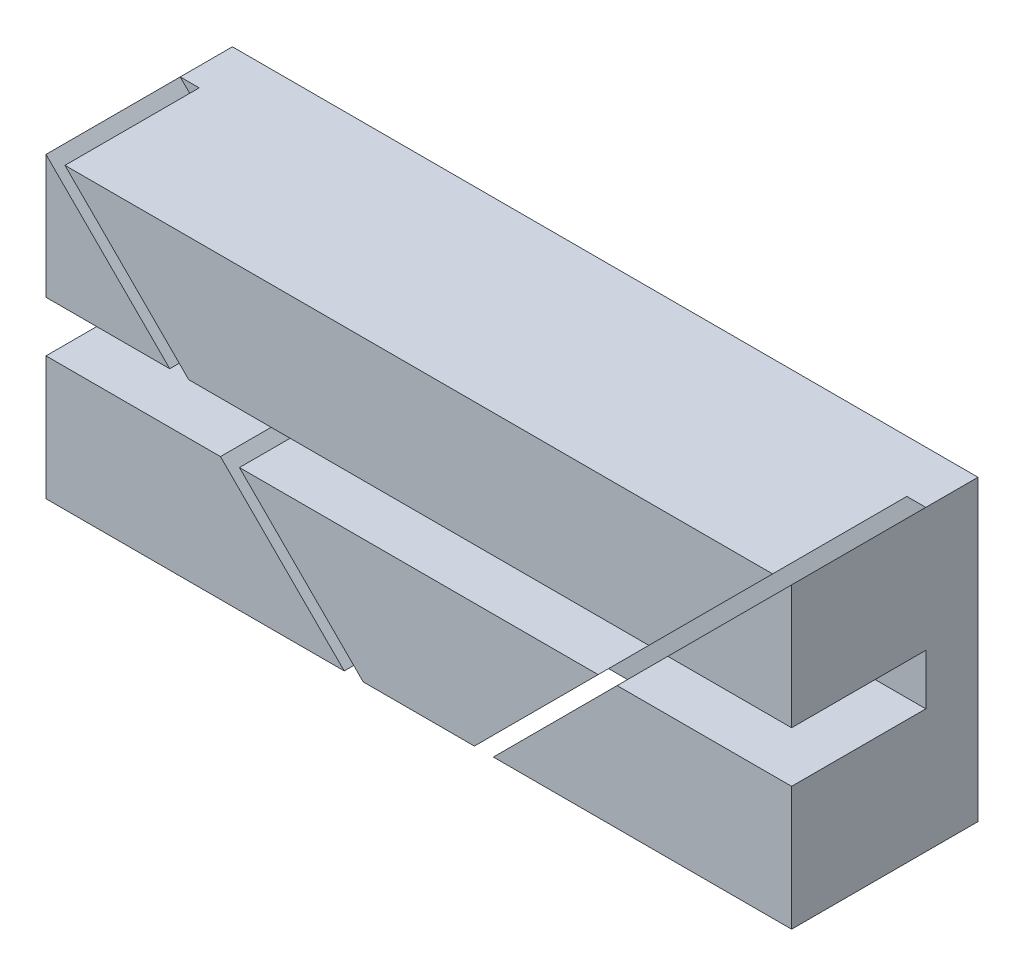
ISO-10303-21;
HEADER;
FILE_DESCRIPTION(('STEP AP214'),'2;1');
FILE_NAME('part.step','',(''),(''),'','','');
FILE_SCHEMA(('AUTOMOTIVE_DESIGN { 1 0 10303 214 1 1 1 1 }'));
ENDSEC;
DATA;
#1=APPLICATION_CONTEXT('core data for automotive mechanical design processes');
#2=APPLICATION_PROTOCOL_DEFINITION('international standard','automotive_design',2000,#1);
#3=PRODUCT_CONTEXT('',#1,'mechanical');
#4=PRODUCT('Part','Part','',(#3));
#5=PRODUCT_RELATED_PRODUCT_CATEGORY('part','',(#4));
#6=PRODUCT_DEFINITION_FORMATION('','',#4);
#7=PRODUCT_DEFINITION_CONTEXT('part definition',#1,'design');
#8=PRODUCT_DEFINITION('design','',#6,#7);
#9=PRODUCT_DEFINITION_SHAPE('','',#8);
#10=(LENGTH_UNIT() NAMED_UNIT(*) SI_UNIT(.MILLI.,.METRE.));
#11=(NAMED_UNIT(*) PLANE_ANGLE_UNIT() SI_UNIT($,.RADIAN.));
#12=(NAMED_UNIT(*) SI_UNIT($,.STERADIAN.) SOLID_ANGLE_UNIT());
#13=UNCERTAINTY_MEASURE_WITH_UNIT(LENGTH_MEASURE(1.E-05),#10,'distance_accuracy_value','');
#14=(GEOMETRIC_REPRESENTATION_CONTEXT(3) GLOBAL_UNCERTAINTY_ASSIGNED_CONTEXT((#13)) GLOBAL_UNIT_ASSIGNED_CONTEXT((#10,
#11,#12)) REPRESENTATION_CONTEXT('',''));
#15=CARTESIAN_POINT('',(0.,0.,0.));
#16=DIRECTION('',(0.,0.,1.));
#17=DIRECTION('',(1.,0.,0.));
#18=AXIS2_PLACEMENT_3D('',#15,#16,#17);
#19=CARTESIAN_POINT('',(63.5,0.,31.75));
#20=DIRECTION('',(1.,0.,0.));
#21=DIRECTION('',(0.,0.,-1.));
#22=AXIS2_PLACEMENT_3D('',#19,#20,#21);
#23=PLANE('',#22);
#24=DIRECTION('',(0.,-1.,0.));
#25=VECTOR('',#24,1.);
#26=CARTESIAN_POINT('',(63.5,0.,31.75));
#27=LINE('',#26,#25);
#28=CARTESIAN_POINT('',(63.5,25.4,31.75));
#29=VERTEX_POINT('',#28);
#30=CARTESIAN_POINT('',(63.5,4.318,31.75));
#31=VERTEX_POINT('',#30);
#32=EDGE_CURVE('E275',#29,#31,#27,.T.);
#33=ORIENTED_EDGE('',*,*,#32,.T.);
#34=DIRECTION('',(0.,0.,1.));
#35=VECTOR('',#34,1.);
#36=CARTESIAN_POINT('',(63.5,4.318,8.89));
#37=LINE('',#36,#35);
#38=CARTESIAN_POINT('',(63.5,4.318,8.89));
#39=VERTEX_POINT('',#38);
#40=EDGE_CURVE('E261',#39,#31,#37,.T.);
#41=ORIENTED_EDGE('',*,*,#40,.F.);
#42=DIRECTION('',(0.,1.,0.));
#43=VECTOR('',#42,1.);
#44=CARTESIAN_POINT('',(63.5,0.,8.89));
#45=LINE('',#44,#43);
#46=CARTESIAN_POINT('',(63.5,-4.318,8.89));
#47=VERTEX_POINT('',#46);
#48=EDGE_CURVE('E265',#47,#39,#45,.T.);
#49=ORIENTED_EDGE('',*,*,#48,.F.);
#50=DIRECTION('',(0.,0.,1.));
#51=VECTOR('',#50,1.);
#52=CARTESIAN_POINT('',(63.5,-4.318,8.89));
#53=LINE('',#52,#51);
#54=CARTESIAN_POINT('',(63.5,-4.318,31.75));
#55=VERTEX_POINT('',#54);
#56=EDGE_CURVE('E276',#47,#55,#53,.T.);
#57=ORIENTED_EDGE('',*,*,#56,.T.);
#58=CARTESIAN_POINT('',(63.5,-25.4,31.75));
#59=VERTEX_POINT('',#58);
#60=EDGE_CURVE('E89',#55,#59,#27,.T.);
#61=ORIENTED_EDGE('',*,*,#60,.T.);
#62=DIRECTION('',(0.,0.,-1.));
#63=VECTOR('',#62,1.);
#64=CARTESIAN_POINT('',(63.5,-25.4,31.75));
#65=LINE('',#64,#63);
#66=CARTESIAN_POINT('',(63.5,-25.4,0.));
#67=VERTEX_POINT('',#66);
#68=EDGE_CURVE('E81',#59,#67,#65,.T.);
#69=ORIENTED_EDGE('',*,*,#68,.T.);
#70=DIRECTION('',(0.,-1.,0.));
#71=VECTOR('',#70,1.);
#72=CARTESIAN_POINT('',(63.5,0.,0.));
#73=LINE('',#72,#71);
#74=CARTESIAN_POINT('',(63.5,25.4,0.));
#75=VERTEX_POINT('',#74);
#76=EDGE_CURVE('E86',#75,#67,#73,.T.);
#77=ORIENTED_EDGE('',*,*,#76,.F.);
#78=DIRECTION('',(0.,0.,-1.));
#79=VECTOR('',#78,1.);
#80=CARTESIAN_POINT('',(63.5,25.4,31.75));
#81=LINE('',#80,#79);
#82=CARTESIAN_POINT('',(63.5,25.4,8.89));
#83=VERTEX_POINT('',#82);
#84=EDGE_CURVE('E45',#83,#75,#81,.T.);
#85=ORIENTED_EDGE('',*,*,#84,.F.);
#86=EDGE_CURVE('E12',#29,#83,#81,.T.);
#87=ORIENTED_EDGE('',*,*,#86,.F.);
#88=EDGE_LOOP('',(#33,#41,#49,#57,#61,#69,#77,#85,#87));
#89=FACE_BOUND('',#88,.T.);
#90=ADVANCED_FACE('F38',(#89),#23,.T.);
#91=CARTESIAN_POINT('',(0.,25.4,31.75));
#92=DIRECTION('',(0.,1.,0.));
#93=DIRECTION('',(0.,0.,1.));
#94=AXIS2_PLACEMENT_3D('',#91,#92,#93);
#95=PLANE('',#94);
#96=DIRECTION('',(-1.,0.,0.));
#97=VECTOR('',#96,1.);
#98=CARTESIAN_POINT('',(0.,25.4,8.89));
#99=LINE('',#98,#97);
#100=CARTESIAN_POINT('',(-60.2671077964151,25.4,8.89));
#101=VERTEX_POINT('',#100);
#102=CARTESIAN_POINT('',(-63.5,25.4,8.89));
#103=VERTEX_POINT('',#102);
#104=EDGE_CURVE('E401',#101,#103,#99,.T.);
#105=ORIENTED_EDGE('',*,*,#104,.F.);
#106=DIRECTION('',(0.,0.,1.));
#107=VECTOR('',#106,1.);
#108=CARTESIAN_POINT('',(-60.2671077964151,25.4,8.89));
#109=LINE('',#108,#107);
#110=CARTESIAN_POINT('',(-60.2671077964151,25.4,31.75));
#111=VERTEX_POINT('',#110);
#112=EDGE_CURVE('E306',#101,#111,#109,.T.);
#113=ORIENTED_EDGE('',*,*,#112,.T.);
#114=DIRECTION('',(1.,0.,0.));
#115=VECTOR('',#114,1.);
#116=CARTESIAN_POINT('',(0.,25.4,31.75));
#117=LINE('',#116,#115);
#118=CARTESIAN_POINT('',(60.2671077964151,25.4,31.75));
#119=VERTEX_POINT('',#118);
#120=EDGE_CURVE('E314',#111,#119,#117,.T.);
#121=ORIENTED_EDGE('',*,*,#120,.T.);
#122=DIRECTION('',(0.,0.,1.));
#123=VECTOR('',#122,1.);
#124=CARTESIAN_POINT('',(60.2671077964151,25.4,8.89));
#125=LINE('',#124,#123);
#126=CARTESIAN_POINT('',(60.2671077964151,25.4,8.89));
#127=VERTEX_POINT('',#126);
#128=EDGE_CURVE('E108',#127,#119,#125,.T.);
#129=ORIENTED_EDGE('',*,*,#128,.F.);
#130=DIRECTION('',(-1.,0.,0.));
#131=VECTOR('',#130,1.);
#132=CARTESIAN_POINT('',(0.,25.4,8.89));
#133=LINE('',#132,#131);
#134=EDGE_CURVE('E134',#83,#127,#133,.T.);
#135=ORIENTED_EDGE('',*,*,#134,.F.);
#136=ORIENTED_EDGE('',*,*,#84,.T.);
#137=DIRECTION('',(1.,0.,0.));
#138=VECTOR('',#137,1.);
#139=CARTESIAN_POINT('',(0.,25.4,0.));
#140=LINE('',#139,#138);
#141=CARTESIAN_POINT('',(-63.5,25.4,0.));
#142=VERTEX_POINT('',#141);
#143=EDGE_CURVE('E107',#142,#75,#140,.T.);
#144=ORIENTED_EDGE('',*,*,#143,.F.);
#145=DIRECTION('',(0.,0.,-1.));
#146=VECTOR('',#145,1.);
#147=CARTESIAN_POINT('',(-63.5,25.4,31.75));
#148=LINE('',#147,#146);
#149=EDGE_CURVE('E117',#103,#142,#148,.T.);
#150=ORIENTED_EDGE('',*,*,#149,.F.);
#151=EDGE_LOOP('',(#105,#113,#121,#129,#135,#136,#144,#150));
#152=FACE_BOUND('',#151,.T.);
#153=ADVANCED_FACE('F129',(#152),#95,.T.);
#154=CARTESIAN_POINT('',(0.,-25.4,31.75));
#155=DIRECTION('',(0.,1.,0.));
#156=DIRECTION('',(0.,0.,1.));
#157=AXIS2_PLACEMENT_3D('',#154,#155,#156);
#158=PLANE('',#157);
#159=DIRECTION('',(0.,0.,1.));
#160=VECTOR('',#159,1.);
#161=CARTESIAN_POINT('',(-9.46710779641491,-25.4,8.89));
#162=LINE('',#161,#160);
#163=CARTESIAN_POINT('',(-9.46710779641491,-25.4,8.89));
#164=VERTEX_POINT('',#163);
#165=CARTESIAN_POINT('',(-9.46710779641491,-25.4,31.75));
#166=VERTEX_POINT('',#165);
#167=EDGE_CURVE('E292',#164,#166,#162,.T.);
#168=ORIENTED_EDGE('',*,*,#167,.F.);
#169=DIRECTION('',(1.,0.,0.));
#170=VECTOR('',#169,1.);
#171=CARTESIAN_POINT('',(0.,-25.4,8.89));
#172=LINE('',#171,#170);
#173=CARTESIAN_POINT('',(-12.6999999999998,-25.4,8.89));
#174=VERTEX_POINT('',#173);
#175=EDGE_CURVE('E418',#174,#164,#172,.T.);
#176=ORIENTED_EDGE('',*,*,#175,.F.);
#177=DIRECTION('',(0.,0.,1.));
#178=VECTOR('',#177,1.);
#179=CARTESIAN_POINT('',(-12.6999999999998,-25.4,8.89));
#180=LINE('',#179,#178);
#181=CARTESIAN_POINT('',(-12.6999999999998,-25.4,31.75));
#182=VERTEX_POINT('',#181);
#183=EDGE_CURVE('E294',#174,#182,#180,.T.);
#184=ORIENTED_EDGE('',*,*,#183,.T.);
#185=DIRECTION('',(1.,0.,0.));
#186=VECTOR('',#185,1.);
#187=CARTESIAN_POINT('',(0.,-25.4,31.75));
#188=LINE('',#187,#186);
#189=CARTESIAN_POINT('',(-63.5,-25.4,31.75));
#190=VERTEX_POINT('',#189);
#191=EDGE_CURVE('E92',#190,#182,#188,.T.);
#192=ORIENTED_EDGE('',*,*,#191,.F.);
#193=DIRECTION('',(0.,0.,-1.));
#194=VECTOR('',#193,1.);
#195=CARTESIAN_POINT('',(-63.5,-25.4,31.75));
#196=LINE('',#195,#194);
#197=CARTESIAN_POINT('',(-63.5,-25.4,0.));
#198=VERTEX_POINT('',#197);
#199=EDGE_CURVE('E91',#190,#198,#196,.T.);
#200=ORIENTED_EDGE('',*,*,#199,.T.);
#201=DIRECTION('',(1.,0.,0.));
#202=VECTOR('',#201,1.);
#203=CARTESIAN_POINT('',(0.,-25.4,0.));
#204=LINE('',#203,#202);
#205=EDGE_CURVE('E96',#198,#67,#204,.T.);
#206=ORIENTED_EDGE('',*,*,#205,.T.);
#207=ORIENTED_EDGE('',*,*,#68,.F.);
#208=CARTESIAN_POINT('',(12.6999999999999,-25.4,31.75));
#209=VERTEX_POINT('',#208);
#210=EDGE_CURVE('E61',#209,#59,#188,.T.);
#211=ORIENTED_EDGE('',*,*,#210,.F.);
#212=DIRECTION('',(0.,0.,1.));
#213=VECTOR('',#212,1.);
#214=CARTESIAN_POINT('',(12.6999999999999,-25.4,8.89));
#215=LINE('',#214,#213);
#216=CARTESIAN_POINT('',(12.6999999999999,-25.4,8.89));
#217=VERTEX_POINT('',#216);
#218=EDGE_CURVE('E283',#217,#209,#215,.T.);
#219=ORIENTED_EDGE('',*,*,#218,.F.);
#220=DIRECTION('',(1.,0.,0.));
#221=VECTOR('',#220,1.);
#222=CARTESIAN_POINT('',(0.,-25.4,8.89));
#223=LINE('',#222,#221);
#224=CARTESIAN_POINT('',(9.46710779641494,-25.4,8.89));
#225=VERTEX_POINT('',#224);
#226=EDGE_CURVE('E345',#225,#217,#223,.T.);
#227=ORIENTED_EDGE('',*,*,#226,.F.);
#228=DIRECTION('',(0.,0.,1.));
#229=VECTOR('',#228,1.);
#230=CARTESIAN_POINT('',(9.46710779641494,-25.4,8.89));
#231=LINE('',#230,#229);
#232=CARTESIAN_POINT('',(9.46710779641494,-25.4,31.75));
#233=VERTEX_POINT('',#232);
#234=EDGE_CURVE('E285',#225,#233,#231,.T.);
#235=ORIENTED_EDGE('',*,*,#234,.T.);
#236=EDGE_CURVE('E322',#166,#233,#188,.T.);
#237=ORIENTED_EDGE('',*,*,#236,.F.);
#238=EDGE_LOOP('',(#168,#176,#184,#192,#200,#206,#207,#211,#219,#227,#235,#237));
#239=FACE_BOUND('',#238,.T.);
#240=ADVANCED_FACE('F98',(#239),#158,.F.);
#241=CARTESIAN_POINT('',(0.,0.,31.75));
#242=DIRECTION('',(0.,0.,1.));
#243=DIRECTION('',(1.,0.,0.));
#244=AXIS2_PLACEMENT_3D('',#241,#242,#243);
#245=PLANE('',#244);
#246=ORIENTED_EDGE('',*,*,#32,.F.);
#247=DIRECTION('',(-0.707106781186549,-0.707106781186546,0.));
#248=VECTOR('',#247,1.);
#249=CARTESIAN_POINT('',(19.0499999999999,-19.05,31.75));
#250=LINE('',#249,#248);
#251=CARTESIAN_POINT('',(42.4179999999999,4.318,31.75));
#252=VERTEX_POINT('',#251);
#253=EDGE_CURVE('E392',#29,#252,#250,.T.);
#254=ORIENTED_EDGE('',*,*,#253,.T.);
#255=DIRECTION('',(1.,0.,0.));
#256=VECTOR('',#255,1.);
#257=CARTESIAN_POINT('',(0.,4.318,31.75));
#258=LINE('',#257,#256);
#259=EDGE_CURVE('E390',#252,#31,#258,.T.);
#260=ORIENTED_EDGE('',*,*,#259,.T.);
#261=EDGE_LOOP('',(#246,#254,#260));
#262=FACE_BOUND('',#261,.T.);
#263=ADVANCED_FACE('F452',(#262),#245,.T.);
#264=DIRECTION('',(1.,0.,0.));
#265=VECTOR('',#264,1.);
#266=CARTESIAN_POINT('',(0.,-4.318,31.75));
#267=LINE('',#266,#265);
#268=CARTESIAN_POINT('',(33.7819999999999,-4.318,31.75));
#269=VERTEX_POINT('',#268);
#270=EDGE_CURVE('E388',#269,#55,#267,.T.);
#271=ORIENTED_EDGE('',*,*,#270,.F.);
#272=DIRECTION('',(-0.707106781186549,-0.707106781186546,0.));
#273=VECTOR('',#272,1.);
#274=CARTESIAN_POINT('',(19.0499999999999,-19.05,31.75));
#275=LINE('',#274,#273);
#276=EDGE_CURVE('E386',#269,#209,#275,.T.);
#277=ORIENTED_EDGE('',*,*,#276,.T.);
#278=ORIENTED_EDGE('',*,*,#210,.T.);
#279=ORIENTED_EDGE('',*,*,#60,.F.);
#280=EDGE_LOOP('',(#271,#277,#278,#279));
#281=FACE_BOUND('',#280,.T.);
#282=ADVANCED_FACE('F442',(#281),#245,.T.);
#283=DIRECTION('',(-0.707106781186549,-0.707106781186546,0.));
#284=VECTOR('',#283,1.);
#285=CARTESIAN_POINT('',(17.4335538982075,-17.4335538982075,31.75));
#286=LINE('',#285,#284);
#287=CARTESIAN_POINT('',(30.549107796415,-4.318,31.75));
#288=VERTEX_POINT('',#287);
#289=EDGE_CURVE('E339',#288,#233,#286,.T.);
#290=ORIENTED_EDGE('',*,*,#289,.F.);
#291=DIRECTION('',(1.,0.,0.));
#292=VECTOR('',#291,1.);
#293=CARTESIAN_POINT('',(0.,-4.318,31.75));
#294=LINE('',#293,#292);
#295=CARTESIAN_POINT('',(-30.549107796415,-4.318,31.75));
#296=VERTEX_POINT('',#295);
#297=EDGE_CURVE('E382',#296,#288,#294,.T.);
#298=ORIENTED_EDGE('',*,*,#297,.F.);
#299=DIRECTION('',(0.707106781186549,-0.707106781186546,0.));
#300=VECTOR('',#299,1.);
#301=CARTESIAN_POINT('',(-17.4335538982074,-17.4335538982075,31.75));
#302=LINE('',#301,#300);
#303=EDGE_CURVE('E341',#296,#166,#302,.T.);
#304=ORIENTED_EDGE('',*,*,#303,.T.);
#305=ORIENTED_EDGE('',*,*,#236,.T.);
#306=EDGE_LOOP('',(#290,#298,#304,#305));
#307=FACE_BOUND('',#306,.T.);
#308=ADVANCED_FACE('F337',(#307),#245,.T.);
#309=DIRECTION('',(0.,-1.,0.));
#310=VECTOR('',#309,1.);
#311=CARTESIAN_POINT('',(-63.5,0.,31.75));
#312=LINE('',#311,#310);
#313=CARTESIAN_POINT('',(-63.5,25.4,31.75));
#314=VERTEX_POINT('',#313);
#315=CARTESIAN_POINT('',(-63.5,4.318,31.75));
#316=VERTEX_POINT('',#315);
#317=EDGE_CURVE('E317',#314,#316,#312,.T.);
#318=ORIENTED_EDGE('',*,*,#317,.T.);
#319=DIRECTION('',(1.,0.,0.));
#320=VECTOR('',#319,1.);
#321=CARTESIAN_POINT('',(0.,4.318,31.75));
#322=LINE('',#321,#320);
#323=CARTESIAN_POINT('',(-42.4179999999999,4.318,31.75));
#324=VERTEX_POINT('',#323);
#325=EDGE_CURVE('E376',#316,#324,#322,.T.);
#326=ORIENTED_EDGE('',*,*,#325,.T.);
#327=DIRECTION('',(0.707106781186549,-0.707106781186546,0.));
#328=VECTOR('',#327,1.);
#329=CARTESIAN_POINT('',(-19.0499999999999,-19.05,31.75));
#330=LINE('',#329,#328);
#331=EDGE_CURVE('E373',#314,#324,#330,.T.);
#332=ORIENTED_EDGE('',*,*,#331,.F.);
#333=EDGE_LOOP('',(#318,#326,#332));
#334=FACE_BOUND('',#333,.T.);
#335=ADVANCED_FACE('F434',(#334),#245,.T.);
#336=DIRECTION('',(0.707106781186549,-0.707106781186546,0.));
#337=VECTOR('',#336,1.);
#338=CARTESIAN_POINT('',(-19.0499999999999,-19.05,31.75));
#339=LINE('',#338,#337);
#340=CARTESIAN_POINT('',(-33.7819999999999,-4.318,31.75));
#341=VERTEX_POINT('',#340);
#342=EDGE_CURVE('E379',#341,#182,#339,.T.);
#343=ORIENTED_EDGE('',*,*,#342,.F.);
#344=DIRECTION('',(1.,0.,0.));
#345=VECTOR('',#344,1.);
#346=CARTESIAN_POINT('',(0.,-4.318,31.75));
#347=LINE('',#346,#345);
#348=CARTESIAN_POINT('',(-63.5,-4.318,31.75));
#349=VERTEX_POINT('',#348);
#350=EDGE_CURVE('E329',#349,#341,#347,.T.);
#351=ORIENTED_EDGE('',*,*,#350,.F.);
#352=EDGE_CURVE('E316',#349,#190,#312,.T.);
#353=ORIENTED_EDGE('',*,*,#352,.T.);
#354=ORIENTED_EDGE('',*,*,#191,.T.);
#355=EDGE_LOOP('',(#343,#351,#353,#354));
#356=FACE_BOUND('',#355,.T.);
#357=ADVANCED_FACE('F327',(#356),#245,.T.);
#358=CARTESIAN_POINT('',(-63.5,0.,31.75));
#359=DIRECTION('',(1.,0.,0.));
#360=DIRECTION('',(0.,0.,-1.));
#361=AXIS2_PLACEMENT_3D('',#358,#359,#360);
#362=PLANE('',#361);
#363=ORIENTED_EDGE('',*,*,#352,.F.);
#364=DIRECTION('',(0.,0.,1.));
#365=VECTOR('',#364,1.);
#366=CARTESIAN_POINT('',(-63.5,-4.318,8.89));
#367=LINE('',#366,#365);
#368=CARTESIAN_POINT('',(-63.5,-4.318,8.89));
#369=VERTEX_POINT('',#368);
#370=EDGE_CURVE('E299',#369,#349,#367,.T.);
#371=ORIENTED_EDGE('',*,*,#370,.F.);
#372=DIRECTION('',(0.,-1.,0.));
#373=VECTOR('',#372,1.);
#374=CARTESIAN_POINT('',(-63.5,0.,8.89));
#375=LINE('',#374,#373);
#376=CARTESIAN_POINT('',(-63.5,4.318,8.89));
#377=VERTEX_POINT('',#376);
#378=EDGE_CURVE('E409',#377,#369,#375,.T.);
#379=ORIENTED_EDGE('',*,*,#378,.F.);
#380=DIRECTION('',(0.,0.,1.));
#381=VECTOR('',#380,1.);
#382=CARTESIAN_POINT('',(-63.5,4.318,8.89));
#383=LINE('',#382,#381);
#384=EDGE_CURVE('E301',#377,#316,#383,.T.);
#385=ORIENTED_EDGE('',*,*,#384,.T.);
#386=ORIENTED_EDGE('',*,*,#317,.F.);
#387=EDGE_CURVE('E118',#314,#103,#148,.T.);
#388=ORIENTED_EDGE('',*,*,#387,.T.);
#389=ORIENTED_EDGE('',*,*,#149,.T.);
#390=DIRECTION('',(0.,-1.,0.));
#391=VECTOR('',#390,1.);
#392=CARTESIAN_POINT('',(-63.5,0.,0.));
#393=LINE('',#392,#391);
#394=EDGE_CURVE('E103',#142,#198,#393,.T.);
#395=ORIENTED_EDGE('',*,*,#394,.T.);
#396=ORIENTED_EDGE('',*,*,#199,.F.);
#397=EDGE_LOOP('',(#363,#371,#379,#385,#386,#388,#389,#395,#396));
#398=FACE_BOUND('',#397,.T.);
#399=ADVANCED_FACE('F126',(#398),#362,.F.);
#400=DIRECTION('',(-0.707106781186549,-0.707106781186546,0.));
#401=VECTOR('',#400,1.);
#402=CARTESIAN_POINT('',(17.4335538982075,-17.4335538982075,31.75));
#403=LINE('',#402,#401);
#404=CARTESIAN_POINT('',(39.185107796415,4.318,31.75));
#405=VERTEX_POINT('',#404);
#406=EDGE_CURVE('E52',#119,#405,#403,.T.);
#407=ORIENTED_EDGE('',*,*,#406,.F.);
#408=ORIENTED_EDGE('',*,*,#120,.F.);
#409=DIRECTION('',(0.707106781186549,-0.707106781186546,0.));
#410=VECTOR('',#409,1.);
#411=CARTESIAN_POINT('',(-17.4335538982074,-17.4335538982075,31.75));
#412=LINE('',#411,#410);
#413=CARTESIAN_POINT('',(-39.185107796415,4.318,31.75));
#414=VERTEX_POINT('',#413);
#415=EDGE_CURVE('E370',#111,#414,#412,.T.);
#416=ORIENTED_EDGE('',*,*,#415,.T.);
#417=DIRECTION('',(1.,0.,0.));
#418=VECTOR('',#417,1.);
#419=CARTESIAN_POINT('',(0.,4.318,31.75));
#420=LINE('',#419,#418);
#421=EDGE_CURVE('E367',#414,#405,#420,.T.);
#422=ORIENTED_EDGE('',*,*,#421,.T.);
#423=EDGE_LOOP('',(#407,#408,#416,#422));
#424=FACE_BOUND('',#423,.T.);
#425=ADVANCED_FACE('F441',(#424),#245,.T.);
#426=CARTESIAN_POINT('',(0.,0.,0.));
#427=DIRECTION('',(0.,0.,1.));
#428=DIRECTION('',(1.,0.,0.));
#429=AXIS2_PLACEMENT_3D('',#426,#427,#428);
#430=PLANE('',#429);
#431=ORIENTED_EDGE('',*,*,#76,.T.);
#432=ORIENTED_EDGE('',*,*,#205,.F.);
#433=ORIENTED_EDGE('',*,*,#394,.F.);
#434=ORIENTED_EDGE('',*,*,#143,.T.);
#435=EDGE_LOOP('',(#431,#432,#433,#434));
#436=FACE_BOUND('',#435,.T.);
#437=ADVANCED_FACE('F105',(#436),#430,.F.);
#438=CARTESIAN_POINT('',(17.4335538982075,-17.4335538982075,8.89));
#439=DIRECTION('',(-0.707106781186546,0.707106781186549,0.));
#440=DIRECTION('',(-0.707106781186549,-0.707106781186546,0.));
#441=AXIS2_PLACEMENT_3D('',#438,#439,#440);
#442=PLANE('',#441);
#443=ORIENTED_EDGE('',*,*,#406,.T.);
#444=DIRECTION('',(0.,0.,1.));
#445=VECTOR('',#444,1.);
#446=CARTESIAN_POINT('',(39.185107796415,4.318,8.89));
#447=LINE('',#446,#445);
#448=CARTESIAN_POINT('',(39.185107796415,4.318,8.89));
#449=VERTEX_POINT('',#448);
#450=EDGE_CURVE('E311',#449,#405,#447,.T.);
#451=ORIENTED_EDGE('',*,*,#450,.F.);
#452=DIRECTION('',(-0.707106781186549,-0.707106781186546,0.));
#453=VECTOR('',#452,1.);
#454=CARTESIAN_POINT('',(17.4335538982075,-17.4335538982075,8.89));
#455=LINE('',#454,#453);
#456=EDGE_CURVE('E394',#127,#449,#455,.T.);
#457=ORIENTED_EDGE('',*,*,#456,.F.);
#458=ORIENTED_EDGE('',*,*,#128,.T.);
#459=EDGE_LOOP('',(#443,#451,#457,#458));
#460=FACE_BOUND('',#459,.T.);
#461=ADVANCED_FACE('F457',(#460),#442,.F.);
#462=CARTESIAN_POINT('',(19.0499999999999,-19.05,8.89));
#463=DIRECTION('',(-0.707106781186546,0.707106781186549,0.));
#464=DIRECTION('',(-0.707106781186549,-0.707106781186546,0.));
#465=AXIS2_PLACEMENT_3D('',#462,#463,#464);
#466=PLANE('',#465);
#467=ORIENTED_EDGE('',*,*,#253,.F.);
#468=ORIENTED_EDGE('',*,*,#86,.T.);
#469=DIRECTION('',(-0.707106781186549,-0.707106781186546,0.));
#470=VECTOR('',#469,1.);
#471=CARTESIAN_POINT('',(19.0499999999999,-19.05,8.89));
#472=LINE('',#471,#470);
#473=CARTESIAN_POINT('',(42.4179999999999,4.318,8.89));
#474=VERTEX_POINT('',#473);
#475=EDGE_CURVE('E264',#83,#474,#472,.T.);
#476=ORIENTED_EDGE('',*,*,#475,.T.);
#477=DIRECTION('',(0.,0.,1.));
#478=VECTOR('',#477,1.);
#479=CARTESIAN_POINT('',(42.4179999999999,4.318,8.89));
#480=LINE('',#479,#478);
#481=EDGE_CURVE('E111',#474,#252,#480,.T.);
#482=ORIENTED_EDGE('',*,*,#481,.T.);
#483=EDGE_LOOP('',(#467,#468,#476,#482));
#484=FACE_BOUND('',#483,.T.);
#485=ADVANCED_FACE('F462',(#484),#466,.T.);
#486=CARTESIAN_POINT('',(0.,4.318,8.89));
#487=DIRECTION('',(0.,-1.,0.));
#488=DIRECTION('',(0.,0.,-1.));
#489=AXIS2_PLACEMENT_3D('',#486,#487,#488);
#490=PLANE('',#489);
#491=ORIENTED_EDGE('',*,*,#259,.F.);
#492=ORIENTED_EDGE('',*,*,#481,.F.);
#493=DIRECTION('',(1.,0.,0.));
#494=VECTOR('',#493,1.);
#495=CARTESIAN_POINT('',(0.,4.318,8.89));
#496=LINE('',#495,#494);
#497=EDGE_CURVE('E256',#474,#39,#496,.T.);
#498=ORIENTED_EDGE('',*,*,#497,.T.);
#499=ORIENTED_EDGE('',*,*,#40,.T.);
#500=EDGE_LOOP('',(#491,#492,#498,#499));
#501=FACE_BOUND('',#500,.T.);
#502=ADVANCED_FACE('F259',(#501),#490,.T.);
#503=CARTESIAN_POINT('',(0.,-4.318,8.89));
#504=DIRECTION('',(0.,-1.,0.));
#505=DIRECTION('',(0.,0.,-1.));
#506=AXIS2_PLACEMENT_3D('',#503,#504,#505);
#507=PLANE('',#506);
#508=ORIENTED_EDGE('',*,*,#270,.T.);
#509=ORIENTED_EDGE('',*,*,#56,.F.);
#510=DIRECTION('',(1.,0.,0.));
#511=VECTOR('',#510,1.);
#512=CARTESIAN_POINT('',(0.,-4.318,8.89));
#513=LINE('',#512,#511);
#514=CARTESIAN_POINT('',(33.7819999999999,-4.318,8.89));
#515=VERTEX_POINT('',#514);
#516=EDGE_CURVE('E273',#515,#47,#513,.T.);
#517=ORIENTED_EDGE('',*,*,#516,.F.);
#518=DIRECTION('',(0.,0.,1.));
#519=VECTOR('',#518,1.);
#520=CARTESIAN_POINT('',(33.7819999999999,-4.318,8.89));
#521=LINE('',#520,#519);
#522=EDGE_CURVE('E279',#515,#269,#521,.T.);
#523=ORIENTED_EDGE('',*,*,#522,.T.);
#524=EDGE_LOOP('',(#508,#509,#517,#523));
#525=FACE_BOUND('',#524,.T.);
#526=ADVANCED_FACE('F475',(#525),#507,.F.);
#527=CARTESIAN_POINT('',(19.0499999999999,-19.05,8.89));
#528=DIRECTION('',(-0.707106781186546,0.707106781186549,0.));
#529=DIRECTION('',(-0.707106781186549,-0.707106781186546,0.));
#530=AXIS2_PLACEMENT_3D('',#527,#528,#529);
#531=PLANE('',#530);
#532=ORIENTED_EDGE('',*,*,#276,.F.);
#533=ORIENTED_EDGE('',*,*,#522,.F.);
#534=DIRECTION('',(-0.707106781186549,-0.707106781186546,0.));
#535=VECTOR('',#534,1.);
#536=CARTESIAN_POINT('',(19.0499999999999,-19.05,8.89));
#537=LINE('',#536,#535);
#538=EDGE_CURVE('E356',#515,#217,#537,.T.);
#539=ORIENTED_EDGE('',*,*,#538,.T.);
#540=ORIENTED_EDGE('',*,*,#218,.T.);
#541=EDGE_LOOP('',(#532,#533,#539,#540));
#542=FACE_BOUND('',#541,.T.);
#543=ADVANCED_FACE('F477',(#542),#531,.T.);
#544=CARTESIAN_POINT('',(17.4335538982075,-17.4335538982075,8.89));
#545=DIRECTION('',(-0.707106781186546,0.707106781186549,0.));
#546=DIRECTION('',(-0.707106781186549,-0.707106781186546,0.));
#547=AXIS2_PLACEMENT_3D('',#544,#545,#546);
#548=PLANE('',#547);
#549=ORIENTED_EDGE('',*,*,#289,.T.);
#550=ORIENTED_EDGE('',*,*,#234,.F.);
#551=DIRECTION('',(-0.707106781186549,-0.707106781186546,0.));
#552=VECTOR('',#551,1.);
#553=CARTESIAN_POINT('',(17.4335538982075,-17.4335538982075,8.89));
#554=LINE('',#553,#552);
#555=CARTESIAN_POINT('',(30.549107796415,-4.318,8.89));
#556=VERTEX_POINT('',#555);
#557=EDGE_CURVE('E350',#556,#225,#554,.T.);
#558=ORIENTED_EDGE('',*,*,#557,.F.);
#559=DIRECTION('',(0.,0.,1.));
#560=VECTOR('',#559,1.);
#561=CARTESIAN_POINT('',(30.549107796415,-4.318,8.89));
#562=LINE('',#561,#560);
#563=EDGE_CURVE('E288',#556,#288,#562,.T.);
#564=ORIENTED_EDGE('',*,*,#563,.T.);
#565=EDGE_LOOP('',(#549,#550,#558,#564));
#566=FACE_BOUND('',#565,.T.);
#567=ADVANCED_FACE('F349',(#566),#548,.F.);
#568=CARTESIAN_POINT('',(0.,-4.318,8.89));
#569=DIRECTION('',(0.,-1.,0.));
#570=DIRECTION('',(0.,0.,-1.));
#571=AXIS2_PLACEMENT_3D('',#568,#569,#570);
#572=PLANE('',#571);
#573=ORIENTED_EDGE('',*,*,#297,.T.);
#574=ORIENTED_EDGE('',*,*,#563,.F.);
#575=DIRECTION('',(1.,0.,0.));
#576=VECTOR('',#575,1.);
#577=CARTESIAN_POINT('',(0.,-4.318,8.89));
#578=LINE('',#577,#576);
#579=CARTESIAN_POINT('',(-30.549107796415,-4.318,8.89));
#580=VERTEX_POINT('',#579);
#581=EDGE_CURVE('E354',#580,#556,#578,.T.);
#582=ORIENTED_EDGE('',*,*,#581,.F.);
#583=DIRECTION('',(0.,0.,1.));
#584=VECTOR('',#583,1.);
#585=CARTESIAN_POINT('',(-30.549107796415,-4.318,8.89));
#586=LINE('',#585,#584);
#587=EDGE_CURVE('E290',#580,#296,#586,.T.);
#588=ORIENTED_EDGE('',*,*,#587,.T.);
#589=EDGE_LOOP('',(#573,#574,#582,#588));
#590=FACE_BOUND('',#589,.T.);
#591=ADVANCED_FACE('F484',(#590),#572,.F.);
#592=CARTESIAN_POINT('',(-17.4335538982074,-17.4335538982075,8.89));
#593=DIRECTION('',(-0.707106781186546,-0.707106781186549,0.));
#594=DIRECTION('',(0.707106781186549,-0.707106781186546,0.));
#595=AXIS2_PLACEMENT_3D('',#592,#593,#594);
#596=PLANE('',#595);
#597=ORIENTED_EDGE('',*,*,#303,.F.);
#598=ORIENTED_EDGE('',*,*,#587,.F.);
#599=DIRECTION('',(0.707106781186549,-0.707106781186546,0.));
#600=VECTOR('',#599,1.);
#601=CARTESIAN_POINT('',(-17.4335538982074,-17.4335538982075,8.89));
#602=LINE('',#601,#600);
#603=EDGE_CURVE('E358',#580,#164,#602,.T.);
#604=ORIENTED_EDGE('',*,*,#603,.T.);
#605=ORIENTED_EDGE('',*,*,#167,.T.);
#606=EDGE_LOOP('',(#597,#598,#604,#605));
#607=FACE_BOUND('',#606,.T.);
#608=ADVANCED_FACE('F421',(#607),#596,.T.);
#609=CARTESIAN_POINT('',(-19.0499999999999,-19.05,8.89));
#610=DIRECTION('',(-0.707106781186546,-0.707106781186549,0.));
#611=DIRECTION('',(0.707106781186549,-0.707106781186546,0.));
#612=AXIS2_PLACEMENT_3D('',#609,#610,#611);
#613=PLANE('',#612);
#614=ORIENTED_EDGE('',*,*,#342,.T.);
#615=ORIENTED_EDGE('',*,*,#183,.F.);
#616=DIRECTION('',(0.707106781186549,-0.707106781186546,0.));
#617=VECTOR('',#616,1.);
#618=CARTESIAN_POINT('',(-19.0499999999999,-19.05,8.89));
#619=LINE('',#618,#617);
#620=CARTESIAN_POINT('',(-33.7819999999999,-4.318,8.89));
#621=VERTEX_POINT('',#620);
#622=EDGE_CURVE('E415',#621,#174,#619,.T.);
#623=ORIENTED_EDGE('',*,*,#622,.F.);
#624=DIRECTION('',(0.,0.,1.));
#625=VECTOR('',#624,1.);
#626=CARTESIAN_POINT('',(-33.7819999999999,-4.318,8.89));
#627=LINE('',#626,#625);
#628=EDGE_CURVE('E297',#621,#341,#627,.T.);
#629=ORIENTED_EDGE('',*,*,#628,.T.);
#630=EDGE_LOOP('',(#614,#615,#623,#629));
#631=FACE_BOUND('',#630,.T.);
#632=ADVANCED_FACE('F424',(#631),#613,.F.);
#633=CARTESIAN_POINT('',(0.,-4.318,8.89));
#634=DIRECTION('',(0.,-1.,0.));
#635=DIRECTION('',(0.,0.,-1.));
#636=AXIS2_PLACEMENT_3D('',#633,#634,#635);
#637=PLANE('',#636);
#638=ORIENTED_EDGE('',*,*,#350,.T.);
#639=ORIENTED_EDGE('',*,*,#628,.F.);
#640=DIRECTION('',(1.,0.,0.));
#641=VECTOR('',#640,1.);
#642=CARTESIAN_POINT('',(0.,-4.318,8.89));
#643=LINE('',#642,#641);
#644=EDGE_CURVE('E412',#369,#621,#643,.T.);
#645=ORIENTED_EDGE('',*,*,#644,.F.);
#646=ORIENTED_EDGE('',*,*,#370,.T.);
#647=EDGE_LOOP('',(#638,#639,#645,#646));
#648=FACE_BOUND('',#647,.T.);
#649=ADVANCED_FACE('F426',(#648),#637,.F.);
#650=CARTESIAN_POINT('',(0.,4.318,8.89));
#651=DIRECTION('',(0.,-1.,0.));
#652=DIRECTION('',(0.,0.,-1.));
#653=AXIS2_PLACEMENT_3D('',#650,#651,#652);
#654=PLANE('',#653);
#655=ORIENTED_EDGE('',*,*,#325,.F.);
#656=ORIENTED_EDGE('',*,*,#384,.F.);
#657=DIRECTION('',(1.,0.,0.));
#658=VECTOR('',#657,1.);
#659=CARTESIAN_POINT('',(0.,4.318,8.89));
#660=LINE('',#659,#658);
#661=CARTESIAN_POINT('',(-42.4179999999999,4.318,8.89));
#662=VERTEX_POINT('',#661);
#663=EDGE_CURVE('E407',#377,#662,#660,.T.);
#664=ORIENTED_EDGE('',*,*,#663,.T.);
#665=DIRECTION('',(0.,0.,1.));
#666=VECTOR('',#665,1.);
#667=CARTESIAN_POINT('',(-42.4179999999999,4.318,8.89));
#668=LINE('',#667,#666);
#669=EDGE_CURVE('E304',#662,#324,#668,.T.);
#670=ORIENTED_EDGE('',*,*,#669,.T.);
#671=EDGE_LOOP('',(#655,#656,#664,#670));
#672=FACE_BOUND('',#671,.T.);
#673=ADVANCED_FACE('F431',(#672),#654,.T.);
#674=CARTESIAN_POINT('',(-19.0499999999999,-19.05,8.89));
#675=DIRECTION('',(-0.707106781186546,-0.707106781186549,0.));
#676=DIRECTION('',(0.707106781186549,-0.707106781186546,0.));
#677=AXIS2_PLACEMENT_3D('',#674,#675,#676);
#678=PLANE('',#677);
#679=ORIENTED_EDGE('',*,*,#331,.T.);
#680=ORIENTED_EDGE('',*,*,#669,.F.);
#681=DIRECTION('',(0.707106781186549,-0.707106781186546,0.));
#682=VECTOR('',#681,1.);
#683=CARTESIAN_POINT('',(-19.0499999999999,-19.05,8.89));
#684=LINE('',#683,#682);
#685=EDGE_CURVE('E404',#103,#662,#684,.T.);
#686=ORIENTED_EDGE('',*,*,#685,.F.);
#687=ORIENTED_EDGE('',*,*,#387,.F.);
#688=EDGE_LOOP('',(#679,#680,#686,#687));
#689=FACE_BOUND('',#688,.T.);
#690=ADVANCED_FACE('F433',(#689),#678,.F.);
#691=CARTESIAN_POINT('',(-17.4335538982074,-17.4335538982075,8.89));
#692=DIRECTION('',(-0.707106781186546,-0.707106781186549,0.));
#693=DIRECTION('',(0.707106781186549,-0.707106781186546,0.));
#694=AXIS2_PLACEMENT_3D('',#691,#692,#693);
#695=PLANE('',#694);
#696=ORIENTED_EDGE('',*,*,#415,.F.);
#697=ORIENTED_EDGE('',*,*,#112,.F.);
#698=DIRECTION('',(0.707106781186549,-0.707106781186546,0.));
#699=VECTOR('',#698,1.);
#700=CARTESIAN_POINT('',(-17.4335538982074,-17.4335538982075,8.89));
#701=LINE('',#700,#699);
#702=CARTESIAN_POINT('',(-39.185107796415,4.318,8.89));
#703=VERTEX_POINT('',#702);
#704=EDGE_CURVE('E397',#101,#703,#701,.T.);
#705=ORIENTED_EDGE('',*,*,#704,.T.);
#706=DIRECTION('',(0.,0.,1.));
#707=VECTOR('',#706,1.);
#708=CARTESIAN_POINT('',(-39.185107796415,4.318,8.89));
#709=LINE('',#708,#707);
#710=EDGE_CURVE('E309',#703,#414,#709,.T.);
#711=ORIENTED_EDGE('',*,*,#710,.T.);
#712=EDGE_LOOP('',(#696,#697,#705,#711));
#713=FACE_BOUND('',#712,.T.);
#714=ADVANCED_FACE('F502',(#713),#695,.T.);
#715=CARTESIAN_POINT('',(0.,4.318,8.89));
#716=DIRECTION('',(0.,-1.,0.));
#717=DIRECTION('',(0.,0.,-1.));
#718=AXIS2_PLACEMENT_3D('',#715,#716,#717);
#719=PLANE('',#718);
#720=ORIENTED_EDGE('',*,*,#421,.F.);
#721=ORIENTED_EDGE('',*,*,#710,.F.);
#722=DIRECTION('',(1.,0.,0.));
#723=VECTOR('',#722,1.);
#724=CARTESIAN_POINT('',(0.,4.318,8.89));
#725=LINE('',#724,#723);
#726=EDGE_CURVE('E208',#703,#449,#725,.T.);
#727=ORIENTED_EDGE('',*,*,#726,.T.);
#728=ORIENTED_EDGE('',*,*,#450,.T.);
#729=EDGE_LOOP('',(#720,#721,#727,#728));
#730=FACE_BOUND('',#729,.T.);
#731=ADVANCED_FACE('F505',(#730),#719,.T.);
#732=CARTESIAN_POINT('',(0.,0.,8.89));
#733=DIRECTION('',(0.,0.,1.));
#734=DIRECTION('',(1.,0.,0.));
#735=AXIS2_PLACEMENT_3D('',#732,#733,#734);
#736=PLANE('',#735);
#737=ORIENTED_EDGE('',*,*,#456,.T.);
#738=ORIENTED_EDGE('',*,*,#726,.F.);
#739=ORIENTED_EDGE('',*,*,#704,.F.);
#740=ORIENTED_EDGE('',*,*,#104,.T.);
#741=ORIENTED_EDGE('',*,*,#685,.T.);
#742=ORIENTED_EDGE('',*,*,#663,.F.);
#743=ORIENTED_EDGE('',*,*,#378,.T.);
#744=ORIENTED_EDGE('',*,*,#644,.T.);
#745=ORIENTED_EDGE('',*,*,#622,.T.);
#746=ORIENTED_EDGE('',*,*,#175,.T.);
#747=ORIENTED_EDGE('',*,*,#603,.F.);
#748=ORIENTED_EDGE('',*,*,#581,.T.);
#749=ORIENTED_EDGE('',*,*,#557,.T.);
#750=ORIENTED_EDGE('',*,*,#226,.T.);
#751=ORIENTED_EDGE('',*,*,#538,.F.);
#752=ORIENTED_EDGE('',*,*,#516,.T.);
#753=ORIENTED_EDGE('',*,*,#48,.T.);
#754=ORIENTED_EDGE('',*,*,#497,.F.);
#755=ORIENTED_EDGE('',*,*,#475,.F.);
#756=ORIENTED_EDGE('',*,*,#134,.T.);
#757=EDGE_LOOP('',(#737,#738,#739,#740,#741,#742,#743,#744,#745,#746,#747,#748,#749,#750,#751,
#752,#753,#754,#755,#756));
#758=FACE_BOUND('',#757,.T.);
#759=ADVANCED_FACE('F270',(#758),#736,.T.);
#760=CLOSED_SHELL('',(#90,#153,#240,#263,#282,#308,#335,#357,#399,#425,#437,#461,#485,#502,#526,
#543,#567,#591,#608,#632,#649,#673,#690,#714,#731,#759));
#761=MANIFOLD_SOLID_BREP('B2',#760);
#762=ADVANCED_BREP_SHAPE_REPRESENTATION('',(#18,#761),#14);
#763=SHAPE_DEFINITION_REPRESENTATION(#9,#762);
ENDSEC;
END-ISO-10303-21;
